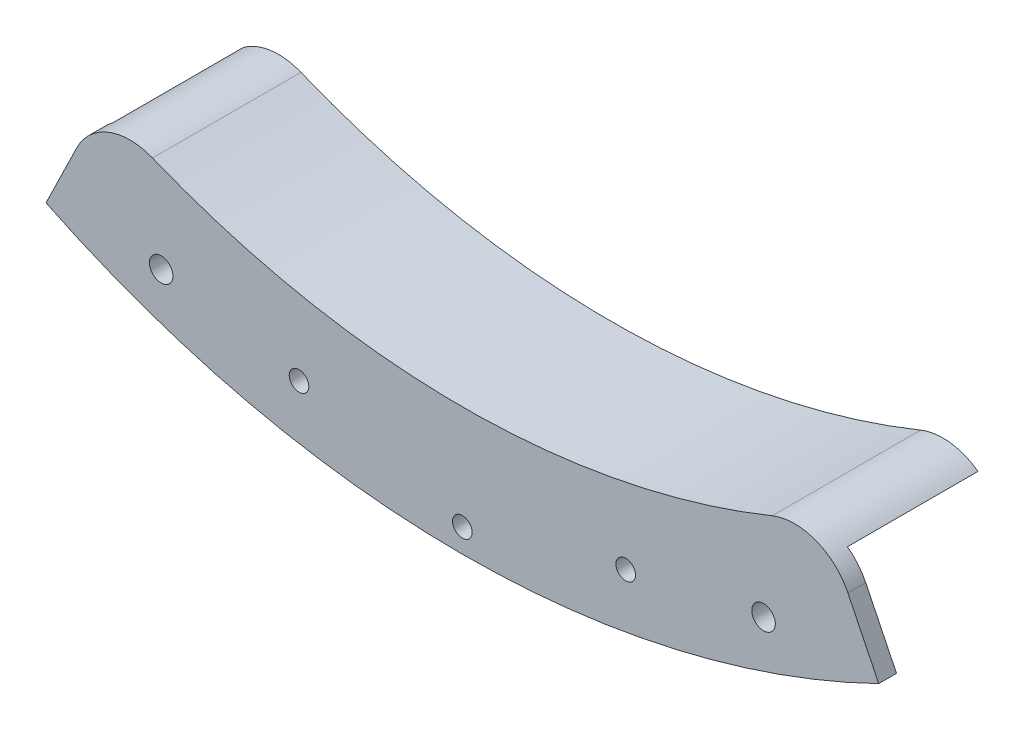
ISO-10303-21;
HEADER;
FILE_DESCRIPTION(('STEP AP214'),'2;1');
FILE_NAME('part.step','',(''),(''),'','','');
FILE_SCHEMA(('AUTOMOTIVE_DESIGN { 1 0 10303 214 1 1 1 1 }'));
ENDSEC;
DATA;
#1=APPLICATION_CONTEXT('core data for automotive mechanical design processes');
#2=APPLICATION_PROTOCOL_DEFINITION('international standard','automotive_design',2000,#1);
#3=PRODUCT_CONTEXT('',#1,'mechanical');
#4=PRODUCT('Part','Part','',(#3));
#5=PRODUCT_RELATED_PRODUCT_CATEGORY('part','',(#4));
#6=PRODUCT_DEFINITION_FORMATION('','',#4);
#7=PRODUCT_DEFINITION_CONTEXT('part definition',#1,'design');
#8=PRODUCT_DEFINITION('design','',#6,#7);
#9=PRODUCT_DEFINITION_SHAPE('','',#8);
#10=(LENGTH_UNIT() NAMED_UNIT(*) SI_UNIT(.MILLI.,.METRE.));
#11=(NAMED_UNIT(*) PLANE_ANGLE_UNIT() SI_UNIT($,.RADIAN.));
#12=(NAMED_UNIT(*) SI_UNIT($,.STERADIAN.) SOLID_ANGLE_UNIT());
#13=UNCERTAINTY_MEASURE_WITH_UNIT(LENGTH_MEASURE(1.E-05),#10,'distance_accuracy_value','');
#14=(GEOMETRIC_REPRESENTATION_CONTEXT(3) GLOBAL_UNCERTAINTY_ASSIGNED_CONTEXT((#13)) GLOBAL_UNIT_ASSIGNED_CONTEXT((#10,
#11,#12)) REPRESENTATION_CONTEXT('',''));
#15=CARTESIAN_POINT('',(0.,0.,0.));
#16=DIRECTION('',(0.,0.,1.));
#17=DIRECTION('',(1.,0.,0.));
#18=AXIS2_PLACEMENT_3D('',#15,#16,#17);
#19=CARTESIAN_POINT('',(0.,0.,25.));
#20=DIRECTION('',(0.,0.,-1.));
#21=DIRECTION('',(-1.,0.,0.));
#22=AXIS2_PLACEMENT_3D('',#19,#20,#21);
#23=CYLINDRICAL_SURFACE('',#22,143.5);
#24=DIRECTION('',(0.,0.,1.));
#25=VECTOR('',#24,1.);
#26=CARTESIAN_POINT('',(-14.5015786457528,-142.765381716931,0.));
#27=LINE('',#26,#25);
#28=CARTESIAN_POINT('',(-14.5015786457528,-142.765381716931,0.));
#29=VERTEX_POINT('',#28);
#30=CARTESIAN_POINT('',(-14.5015786457528,-142.765381716931,22.));
#31=VERTEX_POINT('',#30);
#32=EDGE_CURVE('E205',#29,#31,#27,.T.);
#33=ORIENTED_EDGE('',*,*,#32,.F.);
#34=CARTESIAN_POINT('',(0.,0.,0.));
#35=DIRECTION('',(0.,0.,1.));
#36=DIRECTION('',(1.,0.,0.));
#37=AXIS2_PLACEMENT_3D('',#34,#35,#36);
#38=CIRCLE('',#37,143.5);
#39=CARTESIAN_POINT('',(14.5015786457528,-142.765381716931,0.));
#40=VERTEX_POINT('',#39);
#41=EDGE_CURVE('E347',#29,#40,#38,.T.);
#42=ORIENTED_EDGE('',*,*,#41,.T.);
#43=DIRECTION('',(0.,0.,1.));
#44=VECTOR('',#43,1.);
#45=CARTESIAN_POINT('',(14.5015786457528,-142.765381716931,0.));
#46=LINE('',#45,#44);
#47=CARTESIAN_POINT('',(14.5015786457528,-142.765381716931,22.));
#48=VERTEX_POINT('',#47);
#49=EDGE_CURVE('E195',#40,#48,#46,.T.);
#50=ORIENTED_EDGE('',*,*,#49,.T.);
#51=CARTESIAN_POINT('',(0.,0.,22.));
#52=DIRECTION('',(0.,0.,1.));
#53=DIRECTION('',(1.,0.,0.));
#54=AXIS2_PLACEMENT_3D('',#51,#52,#53);
#55=CIRCLE('',#54,143.5);
#56=EDGE_CURVE('E305',#31,#48,#55,.T.);
#57=ORIENTED_EDGE('',*,*,#56,.F.);
#58=EDGE_LOOP('',(#33,#42,#50,#57));
#59=FACE_BOUND('',#58,.T.);
#60=ADVANCED_FACE('F41',(#59),#23,.T.);
#61=CARTESIAN_POINT('',(0.,0.,22.));
#62=DIRECTION('',(0.,0.,1.));
#63=DIRECTION('',(1.,0.,0.));
#64=AXIS2_PLACEMENT_3D('',#61,#62,#63);
#65=PLANE('',#64);
#66=CARTESIAN_POINT('',(0.,-156.,22.));
#67=DIRECTION('',(0.,0.,1.));
#68=DIRECTION('',(1.,0.,0.));
#69=AXIS2_PLACEMENT_3D('',#66,#67,#68);
#70=CIRCLE('',#69,1.65000000000001);
#71=CARTESIAN_POINT('',(1.64999999999999,-156.,22.));
#72=VERTEX_POINT('',#71);
#73=EDGE_CURVE('E210',#72,#72,#70,.T.);
#74=ORIENTED_EDGE('',*,*,#73,.T.);
#75=EDGE_LOOP('',(#74));
#76=FACE_BOUND('',#75,.T.);
#77=DIRECTION('',(-0.101056297182946,-0.994880708828788,0.));
#78=VECTOR('',#77,1.);
#79=CARTESIAN_POINT('',(0.,0.,22.));
#80=LINE('',#79,#78);
#81=CARTESIAN_POINT('',(-16.1690075492714,-159.180913412606,22.));
#82=VERTEX_POINT('',#81);
#83=EDGE_CURVE('E167',#31,#82,#80,.T.);
#84=ORIENTED_EDGE('',*,*,#83,.F.);
#85=ORIENTED_EDGE('',*,*,#56,.T.);
#86=DIRECTION('',(0.101056297182946,-0.994880708828788,0.));
#87=VECTOR('',#86,1.);
#88=CARTESIAN_POINT('',(0.,0.,22.));
#89=LINE('',#88,#87);
#90=CARTESIAN_POINT('',(16.1690075492714,-159.180913412606,22.));
#91=VERTEX_POINT('',#90);
#92=EDGE_CURVE('E198',#48,#91,#89,.T.);
#93=ORIENTED_EDGE('',*,*,#92,.T.);
#94=CARTESIAN_POINT('',(0.,0.,22.));
#95=DIRECTION('',(0.,0.,1.));
#96=DIRECTION('',(1.,0.,0.));
#97=AXIS2_PLACEMENT_3D('',#94,#95,#96);
#98=CIRCLE('',#97,160.);
#99=EDGE_CURVE('E177',#82,#91,#98,.T.);
#100=ORIENTED_EDGE('',*,*,#99,.F.);
#101=EDGE_LOOP('',(#84,#85,#93,#100));
#102=FACE_BOUND('',#101,.T.);
#103=ADVANCED_FACE('F259',(#76,#102),#65,.F.);
#104=CARTESIAN_POINT('',(19.9713399877694,-142.103467864415,0.));
#105=VERTEX_POINT('',#104);
#106=CARTESIAN_POINT('',(61.8650804193927,-129.479580724924,0.));
#107=VERTEX_POINT('',#106);
#108=EDGE_CURVE('E349',#105,#107,#38,.T.);
#109=ORIENTED_EDGE('',*,*,#108,.T.);
#110=DIRECTION('',(0.,0.,-1.));
#111=VECTOR('',#110,1.);
#112=CARTESIAN_POINT('',(61.8650804193927,-129.479580724924,0.));
#113=LINE('',#112,#111);
#114=CARTESIAN_POINT('',(61.8650804193926,-129.479580724924,22.));
#115=VERTEX_POINT('',#114);
#116=EDGE_CURVE('E318',#107,#115,#113,.F.);
#117=ORIENTED_EDGE('',*,*,#116,.T.);
#118=CARTESIAN_POINT('',(19.9713399877694,-142.103467864415,22.));
#119=VERTEX_POINT('',#118);
#120=EDGE_CURVE('E180',#119,#115,#55,.T.);
#121=ORIENTED_EDGE('',*,*,#120,.F.);
#122=DIRECTION('',(0.,0.,1.));
#123=VECTOR('',#122,1.);
#124=CARTESIAN_POINT('',(19.9713399877694,-142.103467864415,0.));
#125=LINE('',#124,#123);
#126=EDGE_CURVE('E191',#105,#119,#125,.T.);
#127=ORIENTED_EDGE('',*,*,#126,.F.);
#128=EDGE_LOOP('',(#109,#117,#121,#127));
#129=FACE_BOUND('',#128,.T.);
#130=ADVANCED_FACE('F282',(#129),#23,.T.);
#131=CARTESIAN_POINT('',(50.7369308564015,-143.81242591401,22.));
#132=DIRECTION('',(0.,0.,-1.));
#133=DIRECTION('',(1.,0.,0.));
#134=AXIS2_PLACEMENT_3D('',#131,#132,#133);
#135=CIRCLE('',#134,1.98455279554152);
#136=CARTESIAN_POINT('',(52.721483651943,-143.81242591401,22.));
#137=VERTEX_POINT('',#136);
#138=EDGE_CURVE('E233',#137,#137,#135,.T.);
#139=ORIENTED_EDGE('',*,*,#138,.F.);
#140=EDGE_LOOP('',(#139));
#141=FACE_BOUND('',#140,.T.);
#142=CARTESIAN_POINT('',(27.5175643493143,-148.471491042157,22.));
#143=DIRECTION('',(0.,0.,1.));
#144=DIRECTION('',(1.,0.,0.));
#145=AXIS2_PLACEMENT_3D('',#142,#143,#144);
#146=CIRCLE('',#145,1.64999999999998);
#147=CARTESIAN_POINT('',(29.1675643493143,-148.471491042157,22.));
#148=VERTEX_POINT('',#147);
#149=EDGE_CURVE('E168',#148,#148,#146,.T.);
#150=ORIENTED_EDGE('',*,*,#149,.T.);
#151=EDGE_LOOP('',(#150));
#152=FACE_BOUND('',#151,.T.);
#153=ORIENTED_EDGE('',*,*,#120,.T.);
#154=CARTESIAN_POINT('',(55.9624074124523,-137.551659228825,22.));
#155=DIRECTION('',(0.,0.,1.));
#156=DIRECTION('',(1.,0.,0.));
#157=AXIS2_PLACEMENT_3D('',#154,#155,#156);
#158=CIRCLE('',#157,10.);
#159=CARTESIAN_POINT('',(64.950347875444,-133.167947760934,22.));
#160=VERTEX_POINT('',#159);
#161=EDGE_CURVE('E325',#115,#160,#158,.F.);
#162=ORIENTED_EDGE('',*,*,#161,.T.);
#163=DIRECTION('',(0.438371146789079,-0.898794046299166,0.));
#164=VECTOR('',#163,1.);
#165=CARTESIAN_POINT('',(0.,0.,22.));
#166=LINE('',#165,#164);
#167=CARTESIAN_POINT('',(70.1393834862526,-143.807047407867,22.));
#168=VERTEX_POINT('',#167);
#169=EDGE_CURVE('E176',#160,#168,#166,.T.);
#170=ORIENTED_EDGE('',*,*,#169,.T.);
#171=CARTESIAN_POINT('',(22.2676961536105,-158.442890998651,22.));
#172=VERTEX_POINT('',#171);
#173=EDGE_CURVE('E179',#172,#168,#98,.T.);
#174=ORIENTED_EDGE('',*,*,#173,.F.);
#175=DIRECTION('',(0.139173100960066,-0.99026806874157,0.));
#176=VECTOR('',#175,1.);
#177=CARTESIAN_POINT('',(0.,0.,22.));
#178=LINE('',#177,#176);
#179=EDGE_CURVE('E201',#119,#172,#178,.T.);
#180=ORIENTED_EDGE('',*,*,#179,.F.);
#181=EDGE_LOOP('',(#153,#162,#170,#174,#180));
#182=FACE_BOUND('',#181,.T.);
#183=ADVANCED_FACE('F260',(#141,#152,#182),#65,.F.);
#184=CARTESIAN_POINT('',(-61.8650804193925,-129.479580724924,22.));
#185=VERTEX_POINT('',#184);
#186=CARTESIAN_POINT('',(-19.9713399877694,-142.103467864415,22.));
#187=VERTEX_POINT('',#186);
#188=EDGE_CURVE('E166',#185,#187,#55,.T.);
#189=ORIENTED_EDGE('',*,*,#188,.F.);
#190=DIRECTION('',(0.,0.,-1.));
#191=VECTOR('',#190,1.);
#192=CARTESIAN_POINT('',(-61.8650804193925,-129.479580724924,22.));
#193=LINE('',#192,#191);
#194=CARTESIAN_POINT('',(-61.8650804193925,-129.479580724924,0.));
#195=VERTEX_POINT('',#194);
#196=EDGE_CURVE('E11',#185,#195,#193,.T.);
#197=ORIENTED_EDGE('',*,*,#196,.T.);
#198=CARTESIAN_POINT('',(-19.9713399877694,-142.103467864415,0.));
#199=VERTEX_POINT('',#198);
#200=EDGE_CURVE('E343',#195,#199,#38,.T.);
#201=ORIENTED_EDGE('',*,*,#200,.T.);
#202=DIRECTION('',(0.,0.,1.));
#203=VECTOR('',#202,1.);
#204=CARTESIAN_POINT('',(-19.9713399877694,-142.103467864415,0.));
#205=LINE('',#204,#203);
#206=EDGE_CURVE('E160',#199,#187,#205,.T.);
#207=ORIENTED_EDGE('',*,*,#206,.T.);
#208=EDGE_LOOP('',(#189,#197,#201,#207));
#209=FACE_BOUND('',#208,.T.);
#210=ADVANCED_FACE('F283',(#209),#23,.T.);
#211=CARTESIAN_POINT('',(0.,0.,25.));
#212=DIRECTION('',(0.,0.,-1.));
#213=DIRECTION('',(-1.,0.,0.));
#214=AXIS2_PLACEMENT_3D('',#211,#212,#213);
#215=CYLINDRICAL_SURFACE('',#214,138.5);
#216=CARTESIAN_POINT('',(0.,0.,25.));
#217=DIRECTION('',(0.,0.,1.));
#218=DIRECTION('',(1.,0.,0.));
#219=AXIS2_PLACEMENT_3D('',#216,#217,#218);
#220=CIRCLE('',#219,138.5);
#221=CARTESIAN_POINT('',(-52.1938951287854,-128.288921233618,25.));
#222=VERTEX_POINT('',#221);
#223=CARTESIAN_POINT('',(52.1938951287855,-128.288921233618,25.));
#224=VERTEX_POINT('',#223);
#225=EDGE_CURVE('E340',#222,#224,#220,.T.);
#226=ORIENTED_EDGE('',*,*,#225,.T.);
#227=DIRECTION('',(0.,0.,-1.));
#228=VECTOR('',#227,1.);
#229=CARTESIAN_POINT('',(52.1938951287855,-128.288921233618,25.));
#230=LINE('',#229,#228);
#231=CARTESIAN_POINT('',(52.1938951287855,-128.288921233618,0.));
#232=VERTEX_POINT('',#231);
#233=EDGE_CURVE('E316',#224,#232,#230,.T.);
#234=ORIENTED_EDGE('',*,*,#233,.T.);
#235=CARTESIAN_POINT('',(0.,0.,0.));
#236=DIRECTION('',(0.,0.,1.));
#237=DIRECTION('',(1.,0.,0.));
#238=AXIS2_PLACEMENT_3D('',#235,#236,#237);
#239=CIRCLE('',#238,138.5);
#240=CARTESIAN_POINT('',(-52.1938951287854,-128.288921233618,0.));
#241=VERTEX_POINT('',#240);
#242=EDGE_CURVE('E354',#241,#232,#239,.T.);
#243=ORIENTED_EDGE('',*,*,#242,.F.);
#244=DIRECTION('',(0.,0.,-1.));
#245=VECTOR('',#244,1.);
#246=CARTESIAN_POINT('',(-52.1938951287854,-128.288921233618,25.));
#247=LINE('',#246,#245);
#248=EDGE_CURVE('E311',#241,#222,#247,.F.);
#249=ORIENTED_EDGE('',*,*,#248,.T.);
#250=EDGE_LOOP('',(#226,#234,#243,#249));
#251=FACE_BOUND('',#250,.T.);
#252=ADVANCED_FACE('F294',(#251),#215,.F.);
#253=CARTESIAN_POINT('',(0.,0.,25.));
#254=DIRECTION('',(0.898794046299167,-0.438371146789078,0.));
#255=DIRECTION('',(0.438371146789078,0.898794046299166,0.));
#256=AXIS2_PLACEMENT_3D('',#253,#254,#255);
#257=PLANE('',#256);
#258=DIRECTION('',(-0.438371146789078,-0.898794046299167,0.));
#259=VECTOR('',#258,1.);
#260=CARTESIAN_POINT('',(0.,0.,25.));
#261=LINE('',#260,#259);
#262=CARTESIAN_POINT('',(-64.9503478754439,-133.167947760934,25.));
#263=VERTEX_POINT('',#262);
#264=CARTESIAN_POINT('',(-70.1393834862525,-143.807047407867,25.));
#265=VERTEX_POINT('',#264);
#266=EDGE_CURVE('E335',#263,#265,#261,.T.);
#267=ORIENTED_EDGE('',*,*,#266,.F.);
#268=DIRECTION('',(0.,0.,1.));
#269=VECTOR('',#268,1.);
#270=CARTESIAN_POINT('',(-64.9503478754439,-133.167947760934,0.));
#271=LINE('',#270,#269);
#272=CARTESIAN_POINT('',(-64.9503478754439,-133.167947760934,22.));
#273=VERTEX_POINT('',#272);
#274=EDGE_CURVE('E333',#263,#273,#271,.F.);
#275=ORIENTED_EDGE('',*,*,#274,.T.);
#276=DIRECTION('',(-0.438371146789078,-0.898794046299167,0.));
#277=VECTOR('',#276,1.);
#278=CARTESIAN_POINT('',(0.,0.,22.));
#279=LINE('',#278,#277);
#280=CARTESIAN_POINT('',(-70.1393834862525,-143.807047407867,22.));
#281=VERTEX_POINT('',#280);
#282=EDGE_CURVE('E184',#273,#281,#279,.T.);
#283=ORIENTED_EDGE('',*,*,#282,.T.);
#284=DIRECTION('',(0.,0.,1.));
#285=VECTOR('',#284,1.);
#286=CARTESIAN_POINT('',(-70.1393834862525,-143.807047407867,22.));
#287=LINE('',#286,#285);
#288=EDGE_CURVE('E175',#281,#265,#287,.T.);
#289=ORIENTED_EDGE('',*,*,#288,.T.);
#290=EDGE_LOOP('',(#267,#275,#283,#289));
#291=FACE_BOUND('',#290,.T.);
#292=ADVANCED_FACE('F300',(#291),#257,.F.);
#293=CARTESIAN_POINT('',(0.,0.,25.));
#294=DIRECTION('',(0.898794046299166,0.438371146789079,0.));
#295=DIRECTION('',(-0.438371146789079,0.898794046299166,0.));
#296=AXIS2_PLACEMENT_3D('',#293,#294,#295);
#297=PLANE('',#296);
#298=ORIENTED_EDGE('',*,*,#169,.F.);
#299=DIRECTION('',(0.,0.,-1.));
#300=VECTOR('',#299,1.);
#301=CARTESIAN_POINT('',(64.950347875444,-133.167947760934,25.));
#302=LINE('',#301,#300);
#303=CARTESIAN_POINT('',(64.950347875444,-133.167947760934,25.));
#304=VERTEX_POINT('',#303);
#305=EDGE_CURVE('E327',#160,#304,#302,.F.);
#306=ORIENTED_EDGE('',*,*,#305,.T.);
#307=DIRECTION('',(0.438371146789079,-0.898794046299166,0.));
#308=VECTOR('',#307,1.);
#309=CARTESIAN_POINT('',(0.,0.,25.));
#310=LINE('',#309,#308);
#311=CARTESIAN_POINT('',(70.1393834862526,-143.807047407867,25.));
#312=VERTEX_POINT('',#311);
#313=EDGE_CURVE('E345',#304,#312,#310,.T.);
#314=ORIENTED_EDGE('',*,*,#313,.T.);
#315=DIRECTION('',(0.,0.,1.));
#316=VECTOR('',#315,1.);
#317=CARTESIAN_POINT('',(70.1393834862526,-143.807047407867,22.));
#318=LINE('',#317,#316);
#319=EDGE_CURVE('E355',#168,#312,#318,.T.);
#320=ORIENTED_EDGE('',*,*,#319,.F.);
#321=EDGE_LOOP('',(#298,#306,#314,#320));
#322=FACE_BOUND('',#321,.T.);
#323=ADVANCED_FACE('F373',(#322),#297,.T.);
#324=CARTESIAN_POINT('',(0.,0.,25.));
#325=DIRECTION('',(0.,0.,1.));
#326=DIRECTION('',(1.,0.,0.));
#327=AXIS2_PLACEMENT_3D('',#324,#325,#326);
#328=PLANE('',#327);
#329=CARTESIAN_POINT('',(-50.7369308564014,-143.81242591401,25.));
#330=DIRECTION('',(0.,0.,-1.));
#331=DIRECTION('',(-1.,0.,0.));
#332=AXIS2_PLACEMENT_3D('',#329,#330,#331);
#333=CIRCLE('',#332,1.98455279554152);
#334=CARTESIAN_POINT('',(-52.721483651943,-143.81242591401,25.));
#335=VERTEX_POINT('',#334);
#336=EDGE_CURVE('E232',#335,#335,#333,.T.);
#337=ORIENTED_EDGE('',*,*,#336,.T.);
#338=EDGE_LOOP('',(#337));
#339=FACE_BOUND('',#338,.T.);
#340=CARTESIAN_POINT('',(50.7369308564015,-143.81242591401,25.));
#341=DIRECTION('',(0.,0.,-1.));
#342=DIRECTION('',(1.,0.,0.));
#343=AXIS2_PLACEMENT_3D('',#340,#341,#342);
#344=CIRCLE('',#343,1.98455279554152);
#345=CARTESIAN_POINT('',(52.721483651943,-143.81242591401,25.));
#346=VERTEX_POINT('',#345);
#347=EDGE_CURVE('E236',#346,#346,#344,.T.);
#348=ORIENTED_EDGE('',*,*,#347,.T.);
#349=EDGE_LOOP('',(#348));
#350=FACE_BOUND('',#349,.T.);
#351=CARTESIAN_POINT('',(27.5175643493143,-148.471491042157,25.));
#352=DIRECTION('',(0.,0.,-1.));
#353=DIRECTION('',(-1.,0.,0.));
#354=AXIS2_PLACEMENT_3D('',#351,#352,#353);
#355=CIRCLE('',#354,1.64999999999998);
#356=CARTESIAN_POINT('',(25.8675643493143,-148.471491042157,25.));
#357=VERTEX_POINT('',#356);
#358=EDGE_CURVE('E216',#357,#357,#355,.T.);
#359=ORIENTED_EDGE('',*,*,#358,.T.);
#360=EDGE_LOOP('',(#359));
#361=FACE_BOUND('',#360,.T.);
#362=CARTESIAN_POINT('',(0.,-156.,25.));
#363=DIRECTION('',(0.,0.,-1.));
#364=DIRECTION('',(-1.,0.,0.));
#365=AXIS2_PLACEMENT_3D('',#362,#363,#364);
#366=CIRCLE('',#365,1.65000000000001);
#367=CARTESIAN_POINT('',(-1.65000000000003,-156.,25.));
#368=VERTEX_POINT('',#367);
#369=EDGE_CURVE('E220',#368,#368,#366,.T.);
#370=ORIENTED_EDGE('',*,*,#369,.T.);
#371=EDGE_LOOP('',(#370));
#372=FACE_BOUND('',#371,.T.);
#373=CARTESIAN_POINT('',(-27.5175643493143,-148.471491042157,25.));
#374=DIRECTION('',(0.,0.,-1.));
#375=DIRECTION('',(-1.,0.,0.));
#376=AXIS2_PLACEMENT_3D('',#373,#374,#375);
#377=CIRCLE('',#376,1.64999999999997);
#378=CARTESIAN_POINT('',(-29.1675643493143,-148.471491042157,25.));
#379=VERTEX_POINT('',#378);
#380=EDGE_CURVE('E217',#379,#379,#377,.T.);
#381=ORIENTED_EDGE('',*,*,#380,.T.);
#382=EDGE_LOOP('',(#381));
#383=FACE_BOUND('',#382,.T.);
#384=ORIENTED_EDGE('',*,*,#313,.F.);
#385=CARTESIAN_POINT('',(55.9624074124523,-137.551659228825,25.));
#386=DIRECTION('',(0.,0.,1.));
#387=DIRECTION('',(1.,0.,0.));
#388=AXIS2_PLACEMENT_3D('',#385,#386,#387);
#389=CIRCLE('',#388,10.);
#390=EDGE_CURVE('E331',#304,#224,#389,.T.);
#391=ORIENTED_EDGE('',*,*,#390,.T.);
#392=ORIENTED_EDGE('',*,*,#225,.F.);
#393=CARTESIAN_POINT('',(-55.9624074124522,-137.551659228825,25.));
#394=DIRECTION('',(0.,0.,1.));
#395=DIRECTION('',(1.,0.,0.));
#396=AXIS2_PLACEMENT_3D('',#393,#394,#395);
#397=CIRCLE('',#396,10.);
#398=EDGE_CURVE('E329',#222,#263,#397,.T.);
#399=ORIENTED_EDGE('',*,*,#398,.T.);
#400=ORIENTED_EDGE('',*,*,#266,.T.);
#401=CARTESIAN_POINT('',(0.,0.,25.));
#402=DIRECTION('',(0.,0.,1.));
#403=DIRECTION('',(1.,0.,0.));
#404=AXIS2_PLACEMENT_3D('',#401,#402,#403);
#405=CIRCLE('',#404,160.);
#406=EDGE_CURVE('E188',#265,#312,#405,.T.);
#407=ORIENTED_EDGE('',*,*,#406,.T.);
#408=EDGE_LOOP('',(#384,#391,#392,#399,#400,#407));
#409=FACE_BOUND('',#408,.T.);
#410=ADVANCED_FACE('F245',(#339,#350,#361,#372,#383,#409),#328,.T.);
#411=CARTESIAN_POINT('',(0.,0.,0.));
#412=DIRECTION('',(0.,0.,1.));
#413=DIRECTION('',(1.,0.,0.));
#414=AXIS2_PLACEMENT_3D('',#411,#412,#413);
#415=PLANE('',#414);
#416=ORIENTED_EDGE('',*,*,#242,.T.);
#417=CARTESIAN_POINT('',(55.9624074124523,-137.551659228825,0.));
#418=DIRECTION('',(0.,0.,1.));
#419=DIRECTION('',(1.,0.,0.));
#420=AXIS2_PLACEMENT_3D('',#417,#418,#419);
#421=CIRCLE('',#420,10.);
#422=EDGE_CURVE('E315',#232,#107,#421,.F.);
#423=ORIENTED_EDGE('',*,*,#422,.T.);
#424=ORIENTED_EDGE('',*,*,#108,.F.);
#425=CARTESIAN_POINT('',(0.,0.,0.));
#426=DIRECTION('',(0.,0.,1.));
#427=DIRECTION('',(1.,0.,0.));
#428=AXIS2_PLACEMENT_3D('',#425,#426,#427);
#429=CIRCLE('',#428,143.5);
#430=EDGE_CURVE('E230',#40,#105,#429,.T.);
#431=ORIENTED_EDGE('',*,*,#430,.F.);
#432=ORIENTED_EDGE('',*,*,#41,.F.);
#433=EDGE_CURVE('E229',#199,#29,#429,.T.);
#434=ORIENTED_EDGE('',*,*,#433,.F.);
#435=ORIENTED_EDGE('',*,*,#200,.F.);
#436=CARTESIAN_POINT('',(-55.9624074124522,-137.551659228825,0.));
#437=DIRECTION('',(0.,0.,1.));
#438=DIRECTION('',(1.,0.,0.));
#439=AXIS2_PLACEMENT_3D('',#436,#437,#438);
#440=CIRCLE('',#439,10.);
#441=EDGE_CURVE('E310',#195,#241,#440,.F.);
#442=ORIENTED_EDGE('',*,*,#441,.T.);
#443=EDGE_LOOP('',(#416,#423,#424,#431,#432,#434,#435,#442));
#444=FACE_BOUND('',#443,.T.);
#445=ADVANCED_FACE('F357',(#444),#415,.F.);
#446=CARTESIAN_POINT('',(0.,0.,22.));
#447=DIRECTION('',(0.,0.,1.));
#448=DIRECTION('',(1.,0.,0.));
#449=AXIS2_PLACEMENT_3D('',#446,#447,#448);
#450=CYLINDRICAL_SURFACE('',#449,160.);
#451=CARTESIAN_POINT('',(0.,0.,22.));
#452=DIRECTION('',(0.,0.,1.));
#453=DIRECTION('',(1.,0.,0.));
#454=AXIS2_PLACEMENT_3D('',#451,#452,#453);
#455=CIRCLE('',#454,160.);
#456=EDGE_CURVE('E151',#91,#172,#455,.T.);
#457=ORIENTED_EDGE('',*,*,#456,.T.);
#458=ORIENTED_EDGE('',*,*,#173,.T.);
#459=ORIENTED_EDGE('',*,*,#319,.T.);
#460=ORIENTED_EDGE('',*,*,#406,.F.);
#461=ORIENTED_EDGE('',*,*,#288,.F.);
#462=CARTESIAN_POINT('',(-22.2676961536105,-158.442890998651,22.));
#463=VERTEX_POINT('',#462);
#464=EDGE_CURVE('E165',#281,#463,#98,.T.);
#465=ORIENTED_EDGE('',*,*,#464,.T.);
#466=EDGE_CURVE('E140',#463,#82,#455,.T.);
#467=ORIENTED_EDGE('',*,*,#466,.T.);
#468=ORIENTED_EDGE('',*,*,#99,.T.);
#469=EDGE_LOOP('',(#457,#458,#459,#460,#461,#465,#467,#468));
#470=FACE_BOUND('',#469,.T.);
#471=ADVANCED_FACE('F172',(#470),#450,.T.);
#472=CARTESIAN_POINT('',(-50.7369308564014,-143.81242591401,22.));
#473=DIRECTION('',(0.,0.,-1.));
#474=DIRECTION('',(-1.,0.,0.));
#475=AXIS2_PLACEMENT_3D('',#472,#473,#474);
#476=CIRCLE('',#475,1.98455279554152);
#477=CARTESIAN_POINT('',(-52.721483651943,-143.81242591401,22.));
#478=VERTEX_POINT('',#477);
#479=EDGE_CURVE('E239',#478,#478,#476,.T.);
#480=ORIENTED_EDGE('',*,*,#479,.F.);
#481=EDGE_LOOP('',(#480));
#482=FACE_BOUND('',#481,.T.);
#483=CARTESIAN_POINT('',(-27.5175643493143,-148.471491042157,22.));
#484=DIRECTION('',(0.,0.,1.));
#485=DIRECTION('',(1.,0.,0.));
#486=AXIS2_PLACEMENT_3D('',#483,#484,#485);
#487=CIRCLE('',#486,1.64999999999997);
#488=CARTESIAN_POINT('',(-25.8675643493143,-148.471491042157,22.));
#489=VERTEX_POINT('',#488);
#490=EDGE_CURVE('E213',#489,#489,#487,.T.);
#491=ORIENTED_EDGE('',*,*,#490,.T.);
#492=EDGE_LOOP('',(#491));
#493=FACE_BOUND('',#492,.T.);
#494=ORIENTED_EDGE('',*,*,#282,.F.);
#495=CARTESIAN_POINT('',(-55.9624074124522,-137.551659228825,22.));
#496=DIRECTION('',(0.,0.,1.));
#497=DIRECTION('',(1.,0.,0.));
#498=AXIS2_PLACEMENT_3D('',#495,#496,#497);
#499=CIRCLE('',#498,10.);
#500=EDGE_CURVE('E49',#273,#185,#499,.F.);
#501=ORIENTED_EDGE('',*,*,#500,.T.);
#502=ORIENTED_EDGE('',*,*,#188,.T.);
#503=DIRECTION('',(-0.139173100960066,-0.99026806874157,0.));
#504=VECTOR('',#503,1.);
#505=CARTESIAN_POINT('',(0.,0.,22.));
#506=LINE('',#505,#504);
#507=EDGE_CURVE('E158',#187,#463,#506,.T.);
#508=ORIENTED_EDGE('',*,*,#507,.T.);
#509=ORIENTED_EDGE('',*,*,#464,.F.);
#510=EDGE_LOOP('',(#494,#501,#502,#508,#509));
#511=FACE_BOUND('',#510,.T.);
#512=ADVANCED_FACE('F164',(#482,#493,#511),#65,.F.);
#513=CARTESIAN_POINT('',(0.,0.,0.));
#514=DIRECTION('',(-0.99026806874157,-0.139173100960066,0.));
#515=DIRECTION('',(0.139173100960066,-0.99026806874157,0.));
#516=AXIS2_PLACEMENT_3D('',#513,#514,#515);
#517=PLANE('',#516);
#518=ORIENTED_EDGE('',*,*,#179,.T.);
#519=DIRECTION('',(0.0835038605760394,-0.594160841244942,0.8));
#520=VECTOR('',#519,1.);
#521=CARTESIAN_POINT('',(0.,0.,-191.333333333333));
#522=LINE('',#521,#520);
#523=EDGE_CURVE('E221',#172,#105,#522,.F.);
#524=ORIENTED_EDGE('',*,*,#523,.T.);
#525=ORIENTED_EDGE('',*,*,#126,.T.);
#526=EDGE_LOOP('',(#518,#524,#525));
#527=FACE_BOUND('',#526,.T.);
#528=ADVANCED_FACE('F257',(#527),#517,.F.);
#529=CARTESIAN_POINT('',(0.,0.,0.));
#530=DIRECTION('',(-0.994880708828788,-0.101056297182946,0.));
#531=DIRECTION('',(0.101056297182946,-0.994880708828788,0.));
#532=AXIS2_PLACEMENT_3D('',#529,#530,#531);
#533=PLANE('',#532);
#534=DIRECTION('',(0.0606337783097679,-0.596928425297273,0.8));
#535=VECTOR('',#534,1.);
#536=CARTESIAN_POINT('',(0.,0.,-191.333333333333));
#537=LINE('',#536,#535);
#538=EDGE_CURVE('E161',#91,#40,#537,.F.);
#539=ORIENTED_EDGE('',*,*,#538,.F.);
#540=ORIENTED_EDGE('',*,*,#92,.F.);
#541=ORIENTED_EDGE('',*,*,#49,.F.);
#542=EDGE_LOOP('',(#539,#540,#541));
#543=FACE_BOUND('',#542,.T.);
#544=ADVANCED_FACE('F387',(#543),#533,.T.);
#545=CARTESIAN_POINT('',(0.,0.,0.));
#546=DIRECTION('',(-0.99026806874157,0.139173100960066,0.));
#547=DIRECTION('',(-0.139173100960066,-0.99026806874157,0.));
#548=AXIS2_PLACEMENT_3D('',#545,#546,#547);
#549=PLANE('',#548);
#550=DIRECTION('',(-0.0835038605760394,-0.594160841244942,0.8));
#551=VECTOR('',#550,1.);
#552=CARTESIAN_POINT('',(0.,0.,-191.333333333333));
#553=LINE('',#552,#551);
#554=EDGE_CURVE('E143',#463,#199,#553,.F.);
#555=ORIENTED_EDGE('',*,*,#554,.F.);
#556=ORIENTED_EDGE('',*,*,#507,.F.);
#557=ORIENTED_EDGE('',*,*,#206,.F.);
#558=EDGE_LOOP('',(#555,#556,#557));
#559=FACE_BOUND('',#558,.T.);
#560=ADVANCED_FACE('F157',(#559),#549,.T.);
#561=CARTESIAN_POINT('',(0.,0.,0.));
#562=DIRECTION('',(-0.994880708828788,0.101056297182946,0.));
#563=DIRECTION('',(-0.101056297182946,-0.994880708828788,0.));
#564=AXIS2_PLACEMENT_3D('',#561,#562,#563);
#565=PLANE('',#564);
#566=ORIENTED_EDGE('',*,*,#83,.T.);
#567=DIRECTION('',(-0.0606337783097679,-0.596928425297273,0.8));
#568=VECTOR('',#567,1.);
#569=CARTESIAN_POINT('',(0.,0.,-191.333333333333));
#570=LINE('',#569,#568);
#571=EDGE_CURVE('E146',#82,#29,#570,.F.);
#572=ORIENTED_EDGE('',*,*,#571,.T.);
#573=ORIENTED_EDGE('',*,*,#32,.T.);
#574=EDGE_LOOP('',(#566,#572,#573));
#575=FACE_BOUND('',#574,.T.);
#576=ADVANCED_FACE('F266',(#575),#565,.F.);
#577=CARTESIAN_POINT('',(-27.5175643493143,-148.471491042157,25.));
#578=DIRECTION('',(0.,0.,-1.));
#579=DIRECTION('',(-1.,0.,0.));
#580=AXIS2_PLACEMENT_3D('',#577,#578,#579);
#581=CYLINDRICAL_SURFACE('',#580,1.64999999999997);
#582=ORIENTED_EDGE('',*,*,#380,.F.);
#583=EDGE_LOOP('',(#582));
#584=FACE_BOUND('',#583,.T.);
#585=ORIENTED_EDGE('',*,*,#490,.F.);
#586=EDGE_LOOP('',(#585));
#587=FACE_BOUND('',#586,.T.);
#588=ADVANCED_FACE('F263',(#584,#587),#581,.F.);
#589=CARTESIAN_POINT('',(0.,-156.,25.));
#590=DIRECTION('',(0.,0.,-1.));
#591=DIRECTION('',(-1.,0.,0.));
#592=AXIS2_PLACEMENT_3D('',#589,#590,#591);
#593=CYLINDRICAL_SURFACE('',#592,1.65000000000001);
#594=ORIENTED_EDGE('',*,*,#369,.F.);
#595=EDGE_LOOP('',(#594));
#596=FACE_BOUND('',#595,.T.);
#597=ORIENTED_EDGE('',*,*,#73,.F.);
#598=EDGE_LOOP('',(#597));
#599=FACE_BOUND('',#598,.T.);
#600=ADVANCED_FACE('F265',(#596,#599),#593,.F.);
#601=CARTESIAN_POINT('',(27.5175643493143,-148.471491042157,25.));
#602=DIRECTION('',(0.,0.,-1.));
#603=DIRECTION('',(-1.,0.,0.));
#604=AXIS2_PLACEMENT_3D('',#601,#602,#603);
#605=CYLINDRICAL_SURFACE('',#604,1.64999999999998);
#606=ORIENTED_EDGE('',*,*,#358,.F.);
#607=EDGE_LOOP('',(#606));
#608=FACE_BOUND('',#607,.T.);
#609=ORIENTED_EDGE('',*,*,#149,.F.);
#610=EDGE_LOOP('',(#609));
#611=FACE_BOUND('',#610,.T.);
#612=ADVANCED_FACE('F273',(#608,#611),#605,.F.);
#613=CARTESIAN_POINT('',(0.,0.,0.));
#614=DIRECTION('',(0.,0.,1.));
#615=DIRECTION('',(1.,0.,0.));
#616=AXIS2_PLACEMENT_3D('',#613,#614,#615);
#617=CONICAL_SURFACE('',#616,143.5,0.643501108793285);
#618=ORIENTED_EDGE('',*,*,#554,.T.);
#619=ORIENTED_EDGE('',*,*,#433,.T.);
#620=ORIENTED_EDGE('',*,*,#571,.F.);
#621=ORIENTED_EDGE('',*,*,#466,.F.);
#622=EDGE_LOOP('',(#618,#619,#620,#621));
#623=FACE_BOUND('',#622,.T.);
#624=ADVANCED_FACE('F142',(#623),#617,.T.);
#625=ORIENTED_EDGE('',*,*,#456,.F.);
#626=ORIENTED_EDGE('',*,*,#538,.T.);
#627=ORIENTED_EDGE('',*,*,#430,.T.);
#628=ORIENTED_EDGE('',*,*,#523,.F.);
#629=EDGE_LOOP('',(#625,#626,#627,#628));
#630=FACE_BOUND('',#629,.T.);
#631=ADVANCED_FACE('F411',(#630),#617,.T.);
#632=CARTESIAN_POINT('',(55.9624074124523,-137.551659228825,25.));
#633=DIRECTION('',(0.,0.,-1.));
#634=DIRECTION('',(-1.,0.,0.));
#635=AXIS2_PLACEMENT_3D('',#632,#633,#634);
#636=CYLINDRICAL_SURFACE('',#635,10.);
#637=ORIENTED_EDGE('',*,*,#390,.F.);
#638=ORIENTED_EDGE('',*,*,#305,.F.);
#639=ORIENTED_EDGE('',*,*,#161,.F.);
#640=ORIENTED_EDGE('',*,*,#116,.F.);
#641=ORIENTED_EDGE('',*,*,#422,.F.);
#642=ORIENTED_EDGE('',*,*,#233,.F.);
#643=EDGE_LOOP('',(#637,#638,#639,#640,#641,#642));
#644=FACE_BOUND('',#643,.T.);
#645=ADVANCED_FACE('F367',(#644),#636,.T.);
#646=CARTESIAN_POINT('',(-55.9624074124522,-137.551659228825,25.));
#647=DIRECTION('',(0.,0.,-1.));
#648=DIRECTION('',(-1.,0.,0.));
#649=AXIS2_PLACEMENT_3D('',#646,#647,#648);
#650=CYLINDRICAL_SURFACE('',#649,10.);
#651=ORIENTED_EDGE('',*,*,#398,.F.);
#652=ORIENTED_EDGE('',*,*,#248,.F.);
#653=ORIENTED_EDGE('',*,*,#441,.F.);
#654=ORIENTED_EDGE('',*,*,#196,.F.);
#655=ORIENTED_EDGE('',*,*,#500,.F.);
#656=ORIENTED_EDGE('',*,*,#274,.F.);
#657=EDGE_LOOP('',(#651,#652,#653,#654,#655,#656));
#658=FACE_BOUND('',#657,.T.);
#659=ADVANCED_FACE('F43',(#658),#650,.T.);
#660=CARTESIAN_POINT('',(-50.7369308564014,-143.81242591401,25.));
#661=DIRECTION('',(0.,0.,-1.));
#662=DIRECTION('',(-1.,0.,0.));
#663=AXIS2_PLACEMENT_3D('',#660,#661,#662);
#664=CYLINDRICAL_SURFACE('',#663,1.98455279554152);
#665=ORIENTED_EDGE('',*,*,#336,.F.);
#666=EDGE_LOOP('',(#665));
#667=FACE_BOUND('',#666,.T.);
#668=ORIENTED_EDGE('',*,*,#479,.T.);
#669=EDGE_LOOP('',(#668));
#670=FACE_BOUND('',#669,.T.);
#671=ADVANCED_FACE('F248',(#667,#670),#664,.F.);
#672=CARTESIAN_POINT('',(50.7369308564015,-143.81242591401,25.));
#673=DIRECTION('',(0.,0.,-1.));
#674=DIRECTION('',(-1.,0.,0.));
#675=AXIS2_PLACEMENT_3D('',#672,#673,#674);
#676=CYLINDRICAL_SURFACE('',#675,1.98455279554152);
#677=ORIENTED_EDGE('',*,*,#347,.F.);
#678=EDGE_LOOP('',(#677));
#679=FACE_BOUND('',#678,.T.);
#680=ORIENTED_EDGE('',*,*,#138,.T.);
#681=EDGE_LOOP('',(#680));
#682=FACE_BOUND('',#681,.T.);
#683=ADVANCED_FACE('F251',(#679,#682),#676,.F.);
#684=CLOSED_SHELL('',(#60,#103,#130,#183,#210,#252,#292,#323,#410,#445,#471,#512,#528,#544,#560,
#576,#588,#600,#612,#624,#631,#645,#659,#671,#683));
#685=MANIFOLD_SOLID_BREP('B2',#684);
#686=ADVANCED_BREP_SHAPE_REPRESENTATION('',(#18,#685),#14);
#687=SHAPE_DEFINITION_REPRESENTATION(#9,#686);
ENDSEC;
END-ISO-10303-21;
